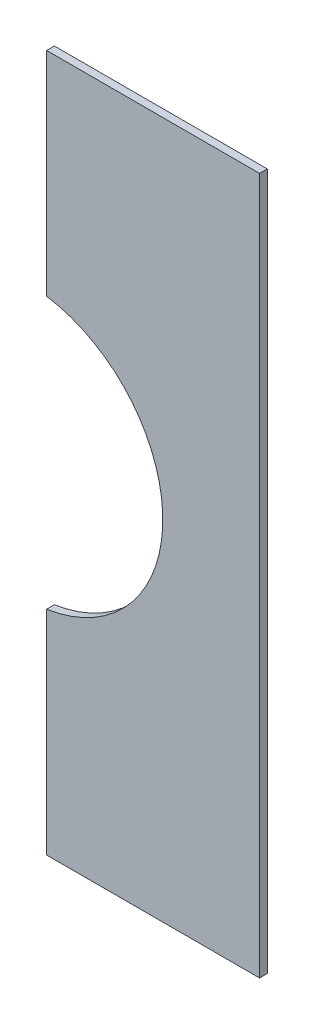
ISO-10303-21;
HEADER;
FILE_DESCRIPTION(('STEP AP214'),'2;1');
FILE_NAME('part.step','',(''),(''),'','','');
FILE_SCHEMA(('AUTOMOTIVE_DESIGN { 1 0 10303 214 1 1 1 1 }'));
ENDSEC;
DATA;
#1=APPLICATION_CONTEXT('core data for automotive mechanical design processes');
#2=APPLICATION_PROTOCOL_DEFINITION('international standard','automotive_design',2000,#1);
#3=PRODUCT_CONTEXT('',#1,'mechanical');
#4=PRODUCT('Part','Part','',(#3));
#5=PRODUCT_RELATED_PRODUCT_CATEGORY('part','',(#4));
#6=PRODUCT_DEFINITION_FORMATION('','',#4);
#7=PRODUCT_DEFINITION_CONTEXT('part definition',#1,'design');
#8=PRODUCT_DEFINITION('design','',#6,#7);
#9=PRODUCT_DEFINITION_SHAPE('','',#8);
#10=(LENGTH_UNIT() NAMED_UNIT(*) SI_UNIT(.MILLI.,.METRE.));
#11=(NAMED_UNIT(*) PLANE_ANGLE_UNIT() SI_UNIT($,.RADIAN.));
#12=(NAMED_UNIT(*) SI_UNIT($,.STERADIAN.) SOLID_ANGLE_UNIT());
#13=UNCERTAINTY_MEASURE_WITH_UNIT(LENGTH_MEASURE(1.E-05),#10,'distance_accuracy_value','');
#14=(GEOMETRIC_REPRESENTATION_CONTEXT(3) GLOBAL_UNCERTAINTY_ASSIGNED_CONTEXT((#13)) GLOBAL_UNIT_ASSIGNED_CONTEXT((#10,
#11,#12)) REPRESENTATION_CONTEXT('',''));
#15=CARTESIAN_POINT('',(0.,0.,0.));
#16=DIRECTION('',(0.,0.,1.));
#17=DIRECTION('',(1.,0.,0.));
#18=AXIS2_PLACEMENT_3D('',#15,#16,#17);
#19=CARTESIAN_POINT('',(18.8349999999641,70.1830000001743,2.323253999776));
#20=DIRECTION('',(0.,0.,-1.));
#21=DIRECTION('',(-1.,0.,0.));
#22=AXIS2_PLACEMENT_3D('',#19,#20,#21);
#23=PLANE('',#22);
#24=DIRECTION('',(-2.05103550980011E-10,-1.,0.));
#25=VECTOR('',#24,1.);
#26=CARTESIAN_POINT('',(19.1099999999077,69.9080000001179,2.323253999776));
#27=LINE('',#26,#25);
#28=CARTESIAN_POINT('',(19.1099999999077,69.9080000001179,2.323253999776));
#29=VERTEX_POINT('',#28);
#30=CARTESIAN_POINT('',(19.1100000000923,70.808000000132,2.323253999776));
#31=VERTEX_POINT('',#30);
#32=EDGE_CURVE('E106',#29,#31,#27,.F.);
#33=ORIENTED_EDGE('',*,*,#32,.T.);
#34=DIRECTION('',(1.,-2.05103550980011E-10,0.));
#35=VECTOR('',#34,1.);
#36=CARTESIAN_POINT('',(19.1100000000923,70.8080000001179,2.323253999776));
#37=LINE('',#36,#35);
#38=CARTESIAN_POINT('',(18.8350000000923,70.8080000001743,2.323253999776));
#39=VERTEX_POINT('',#38);
#40=EDGE_CURVE('E122',#31,#39,#37,.F.);
#41=ORIENTED_EDGE('',*,*,#40,.T.);
#42=DIRECTION('',(2.05103550980011E-10,1.,0.));
#43=VECTOR('',#42,1.);
#44=CARTESIAN_POINT('',(18.8350000000923,70.8080000001743,2.323253999776));
#45=LINE('',#44,#43);
#46=CARTESIAN_POINT('',(18.8350000000359,70.5330000001741,2.323253999776));
#47=VERTEX_POINT('',#46);
#48=EDGE_CURVE('E68',#39,#47,#45,.F.);
#49=ORIENTED_EDGE('',*,*,#48,.T.);
#50=CARTESIAN_POINT('',(18.807916666667,70.3580000001799,2.323253999776));
#51=DIRECTION('',(0.,0.,1.));
#52=DIRECTION('',(1.,0.,0.));
#53=AXIS2_PLACEMENT_3D('',#50,#51,#52);
#54=CIRCLE('',#53,0.177083333333);
#55=CARTESIAN_POINT('',(18.8349999999641,70.1830000001746,2.323253999776));
#56=VERTEX_POINT('',#55);
#57=EDGE_CURVE('E20',#47,#56,#54,.F.);
#58=ORIENTED_EDGE('',*,*,#57,.T.);
#59=DIRECTION('',(2.05103550980011E-10,1.,0.));
#60=VECTOR('',#59,1.);
#61=CARTESIAN_POINT('',(18.8349999999641,70.1830000001743,2.323253999776));
#62=LINE('',#61,#60);
#63=CARTESIAN_POINT('',(18.8349999999077,69.9080000001743,2.323253999776));
#64=VERTEX_POINT('',#63);
#65=EDGE_CURVE('E73',#56,#64,#62,.F.);
#66=ORIENTED_EDGE('',*,*,#65,.T.);
#67=DIRECTION('',(-1.,2.05103550980011E-10,0.));
#68=VECTOR('',#67,1.);
#69=CARTESIAN_POINT('',(18.8349999999077,69.9080000001743,2.323253999776));
#70=LINE('',#69,#68);
#71=EDGE_CURVE('E81',#64,#29,#70,.F.);
#72=ORIENTED_EDGE('',*,*,#71,.T.);
#73=EDGE_LOOP('',(#33,#41,#49,#58,#66,#72));
#74=FACE_BOUND('',#73,.T.);
#75=ADVANCED_FACE('F17',(#74),#23,.F.);
#76=CARTESIAN_POINT('',(18.8349999999077,69.9080000001743,2.313254));
#77=DIRECTION('',(2.05103550980011E-10,1.,0.));
#78=DIRECTION('',(-1.,2.05103550980011E-10,0.));
#79=AXIS2_PLACEMENT_3D('',#76,#77,#78);
#80=PLANE('',#79);
#81=ORIENTED_EDGE('',*,*,#71,.F.);
#82=DIRECTION('',(0.,0.,1.));
#83=VECTOR('',#82,1.);
#84=CARTESIAN_POINT('',(18.8349999999077,69.9080000001743,2.313254));
#85=LINE('',#84,#83);
#86=CARTESIAN_POINT('',(18.8349999999077,69.9080000001367,2.313254));
#87=VERTEX_POINT('',#86);
#88=EDGE_CURVE('E79',#64,#87,#85,.F.);
#89=ORIENTED_EDGE('',*,*,#88,.T.);
#90=DIRECTION('',(-1.,0.,0.));
#91=VECTOR('',#90,1.);
#92=CARTESIAN_POINT('',(18.8349999999641,69.9080000001179,2.313254));
#93=LINE('',#92,#91);
#94=CARTESIAN_POINT('',(19.11,69.9080000001179,2.313254));
#95=VERTEX_POINT('',#94);
#96=EDGE_CURVE('E97',#95,#87,#93,.T.);
#97=ORIENTED_EDGE('',*,*,#96,.F.);
#98=DIRECTION('',(0.,0.,1.));
#99=VECTOR('',#98,1.);
#100=CARTESIAN_POINT('',(19.1099999999077,69.9080000001179,2.313254));
#101=LINE('',#100,#99);
#102=EDGE_CURVE('E103',#95,#29,#101,.T.);
#103=ORIENTED_EDGE('',*,*,#102,.T.);
#104=EDGE_LOOP('',(#81,#89,#97,#103));
#105=FACE_BOUND('',#104,.T.);
#106=ADVANCED_FACE('F167',(#105),#80,.F.);
#107=CARTESIAN_POINT('',(18.8349999999641,70.1830000001743,2.313254));
#108=DIRECTION('',(1.,-2.05103550980011E-10,0.));
#109=DIRECTION('',(2.05103550980011E-10,1.,0.));
#110=AXIS2_PLACEMENT_3D('',#107,#108,#109);
#111=PLANE('',#110);
#112=ORIENTED_EDGE('',*,*,#65,.F.);
#113=DIRECTION('',(0.,0.,1.));
#114=VECTOR('',#113,1.);
#115=CARTESIAN_POINT('',(18.8349999999641,70.1830000001746,2.313254));
#116=LINE('',#115,#114);
#117=CARTESIAN_POINT('',(18.8349999999359,70.1830000001703,2.313254));
#118=VERTEX_POINT('',#117);
#119=EDGE_CURVE('E77',#56,#118,#116,.F.);
#120=ORIENTED_EDGE('',*,*,#119,.T.);
#121=DIRECTION('',(0.,1.,0.));
#122=VECTOR('',#121,1.);
#123=CARTESIAN_POINT('',(18.8349999999077,70.1830000001743,2.313254));
#124=LINE('',#123,#122);
#125=EDGE_CURVE('E100',#87,#118,#124,.T.);
#126=ORIENTED_EDGE('',*,*,#125,.F.);
#127=ORIENTED_EDGE('',*,*,#88,.F.);
#128=EDGE_LOOP('',(#112,#120,#126,#127));
#129=FACE_BOUND('',#128,.T.);
#130=ADVANCED_FACE('F74',(#129),#111,.F.);
#131=CARTESIAN_POINT('',(18.807916666667,70.3580000001799,2.313254));
#132=DIRECTION('',(0.,0.,1.));
#133=DIRECTION('',(1.,0.,0.));
#134=AXIS2_PLACEMENT_3D('',#131,#132,#133);
#135=CYLINDRICAL_SURFACE('',#134,0.177083333333);
#136=DIRECTION('',(0.,0.,1.));
#137=VECTOR('',#136,1.);
#138=CARTESIAN_POINT('',(18.8350000000359,70.5330000001742,2.313254));
#139=LINE('',#138,#137);
#140=CARTESIAN_POINT('',(18.8350000000359,70.5330000001741,2.313254));
#141=VERTEX_POINT('',#140);
#142=EDGE_CURVE('E119',#47,#141,#139,.F.);
#143=ORIENTED_EDGE('',*,*,#142,.T.);
#144=CARTESIAN_POINT('',(18.807916666667,70.3580000001799,2.313254));
#145=DIRECTION('',(0.,0.,1.));
#146=DIRECTION('',(1.,0.,0.));
#147=AXIS2_PLACEMENT_3D('',#144,#145,#146);
#148=CIRCLE('',#147,0.177083333333);
#149=EDGE_CURVE('E87',#118,#141,#148,.T.);
#150=ORIENTED_EDGE('',*,*,#149,.F.);
#151=ORIENTED_EDGE('',*,*,#119,.F.);
#152=ORIENTED_EDGE('',*,*,#57,.F.);
#153=EDGE_LOOP('',(#143,#150,#151,#152));
#154=FACE_BOUND('',#153,.T.);
#155=ADVANCED_FACE('F85',(#154),#135,.F.);
#156=CARTESIAN_POINT('',(18.8350000000923,70.8080000001743,2.313254));
#157=DIRECTION('',(1.,-2.05103550980011E-10,0.));
#158=DIRECTION('',(2.05103550980011E-10,1.,0.));
#159=AXIS2_PLACEMENT_3D('',#156,#157,#158);
#160=PLANE('',#159);
#161=ORIENTED_EDGE('',*,*,#48,.F.);
#162=DIRECTION('',(0.,0.,1.));
#163=VECTOR('',#162,1.);
#164=CARTESIAN_POINT('',(18.8350000000923,70.8080000001743,2.313254));
#165=LINE('',#164,#163);
#166=CARTESIAN_POINT('',(18.8350000000547,70.8080000001743,2.313254));
#167=VERTEX_POINT('',#166);
#168=EDGE_CURVE('E107',#39,#167,#165,.F.);
#169=ORIENTED_EDGE('',*,*,#168,.T.);
#170=DIRECTION('',(0.,1.,0.));
#171=VECTOR('',#170,1.);
#172=CARTESIAN_POINT('',(18.8350000000359,70.1830000001743,2.313254));
#173=LINE('',#172,#171);
#174=EDGE_CURVE('E130',#141,#167,#173,.T.);
#175=ORIENTED_EDGE('',*,*,#174,.F.);
#176=ORIENTED_EDGE('',*,*,#142,.F.);
#177=EDGE_LOOP('',(#161,#169,#175,#176));
#178=FACE_BOUND('',#177,.T.);
#179=ADVANCED_FACE('F147',(#178),#160,.F.);
#180=CARTESIAN_POINT('',(19.1100000000923,70.8080000001179,2.313254));
#181=DIRECTION('',(-2.05103550980011E-10,-1.,0.));
#182=DIRECTION('',(1.,-2.05103550980011E-10,0.));
#183=AXIS2_PLACEMENT_3D('',#180,#181,#182);
#184=PLANE('',#183);
#185=ORIENTED_EDGE('',*,*,#40,.F.);
#186=DIRECTION('',(0.,0.,1.));
#187=VECTOR('',#186,1.);
#188=CARTESIAN_POINT('',(19.1100000000923,70.8080000001179,2.313254));
#189=LINE('',#188,#187);
#190=CARTESIAN_POINT('',(19.1100000000923,70.808000000132,2.313254));
#191=VERTEX_POINT('',#190);
#192=EDGE_CURVE('E35',#31,#191,#189,.F.);
#193=ORIENTED_EDGE('',*,*,#192,.T.);
#194=DIRECTION('',(-1.,0.,0.));
#195=VECTOR('',#194,1.);
#196=CARTESIAN_POINT('',(18.8349999999641,70.8080000001743,2.313254));
#197=LINE('',#196,#195);
#198=EDGE_CURVE('E26',#167,#191,#197,.F.);
#199=ORIENTED_EDGE('',*,*,#198,.F.);
#200=ORIENTED_EDGE('',*,*,#168,.F.);
#201=EDGE_LOOP('',(#185,#193,#199,#200));
#202=FACE_BOUND('',#201,.T.);
#203=ADVANCED_FACE('F148',(#202),#184,.F.);
#204=CARTESIAN_POINT('',(19.1099999999077,69.9080000001179,2.313254));
#205=DIRECTION('',(-1.,2.05103550980011E-10,0.));
#206=DIRECTION('',(-2.05103550980011E-10,-1.,0.));
#207=AXIS2_PLACEMENT_3D('',#204,#205,#206);
#208=PLANE('',#207);
#209=ORIENTED_EDGE('',*,*,#32,.F.);
#210=ORIENTED_EDGE('',*,*,#102,.F.);
#211=DIRECTION('',(0.,1.,0.));
#212=VECTOR('',#211,1.);
#213=CARTESIAN_POINT('',(19.1100000000923,70.1830000001743,2.313254));
#214=LINE('',#213,#212);
#215=EDGE_CURVE('E11',#191,#95,#214,.F.);
#216=ORIENTED_EDGE('',*,*,#215,.F.);
#217=ORIENTED_EDGE('',*,*,#192,.F.);
#218=EDGE_LOOP('',(#209,#210,#216,#217));
#219=FACE_BOUND('',#218,.T.);
#220=ADVANCED_FACE('F151',(#219),#208,.F.);
#221=CARTESIAN_POINT('',(18.8349999999641,70.1830000001743,2.313254));
#222=DIRECTION('',(0.,0.,-1.));
#223=DIRECTION('',(-1.,0.,0.));
#224=AXIS2_PLACEMENT_3D('',#221,#222,#223);
#225=PLANE('',#224);
#226=ORIENTED_EDGE('',*,*,#198,.T.);
#227=ORIENTED_EDGE('',*,*,#215,.T.);
#228=ORIENTED_EDGE('',*,*,#96,.T.);
#229=ORIENTED_EDGE('',*,*,#125,.T.);
#230=ORIENTED_EDGE('',*,*,#149,.T.);
#231=ORIENTED_EDGE('',*,*,#174,.T.);
#232=EDGE_LOOP('',(#226,#227,#228,#229,#230,#231));
#233=FACE_BOUND('',#232,.T.);
#234=ADVANCED_FACE('F149',(#233),#225,.T.);
#235=CLOSED_SHELL('',(#75,#106,#130,#155,#179,#203,#220,#234));
#236=MANIFOLD_SOLID_BREP('B1',#235);
#237=ADVANCED_BREP_SHAPE_REPRESENTATION('',(#18,#236),#14);
#238=SHAPE_DEFINITION_REPRESENTATION(#9,#237);
ENDSEC;
END-ISO-10303-21;
